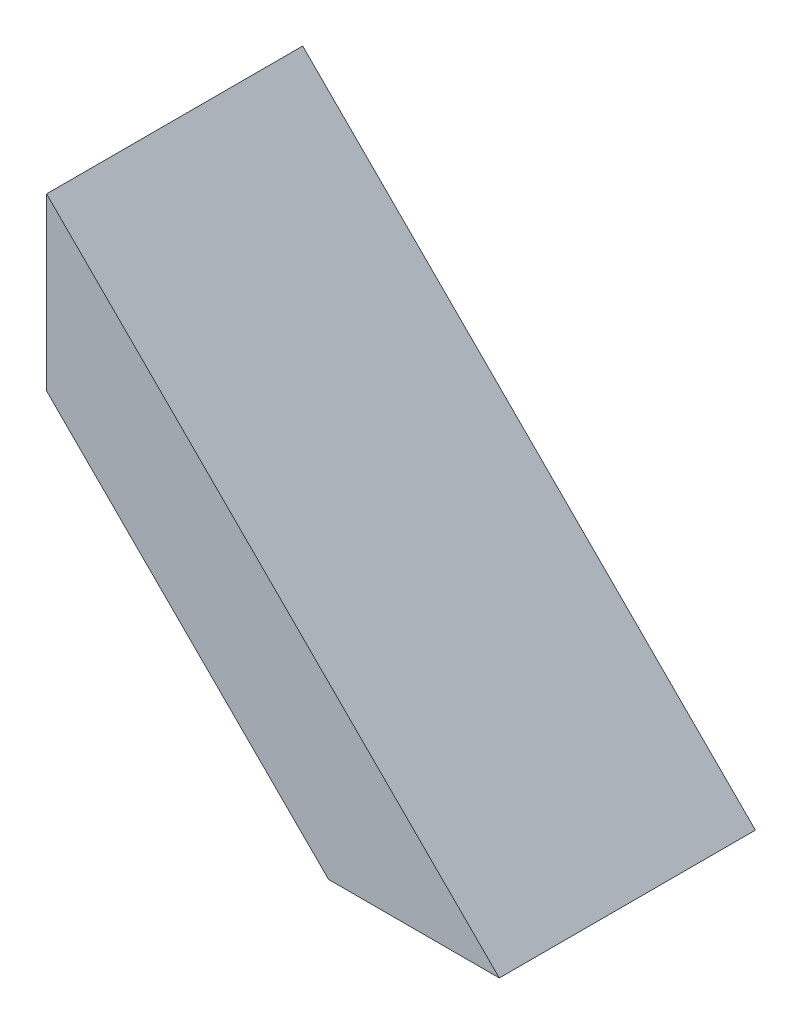
ISO-10303-21;
HEADER;
FILE_DESCRIPTION(('STEP AP214'),'2;1');
FILE_NAME('part.step','',(''),(''),'','','');
FILE_SCHEMA(('AUTOMOTIVE_DESIGN { 1 0 10303 214 1 1 1 1 }'));
ENDSEC;
DATA;
#1=APPLICATION_CONTEXT('core data for automotive mechanical design processes');
#2=APPLICATION_PROTOCOL_DEFINITION('international standard','automotive_design',2000,#1);
#3=PRODUCT_CONTEXT('',#1,'mechanical');
#4=PRODUCT('Part','Part','',(#3));
#5=PRODUCT_RELATED_PRODUCT_CATEGORY('part','',(#4));
#6=PRODUCT_DEFINITION_FORMATION('','',#4);
#7=PRODUCT_DEFINITION_CONTEXT('part definition',#1,'design');
#8=PRODUCT_DEFINITION('design','',#6,#7);
#9=PRODUCT_DEFINITION_SHAPE('','',#8);
#10=(LENGTH_UNIT() NAMED_UNIT(*) SI_UNIT(.MILLI.,.METRE.));
#11=(NAMED_UNIT(*) PLANE_ANGLE_UNIT() SI_UNIT($,.RADIAN.));
#12=(NAMED_UNIT(*) SI_UNIT($,.STERADIAN.) SOLID_ANGLE_UNIT());
#13=UNCERTAINTY_MEASURE_WITH_UNIT(LENGTH_MEASURE(1.E-05),#10,'distance_accuracy_value','');
#14=(GEOMETRIC_REPRESENTATION_CONTEXT(3) GLOBAL_UNCERTAINTY_ASSIGNED_CONTEXT((#13)) GLOBAL_UNIT_ASSIGNED_CONTEXT((#10,
#11,#12)) REPRESENTATION_CONTEXT('',''));
#15=CARTESIAN_POINT('',(0.,0.,0.));
#16=DIRECTION('',(0.,0.,1.));
#17=DIRECTION('',(1.,0.,0.));
#18=AXIS2_PLACEMENT_3D('',#15,#16,#17);
#19=CARTESIAN_POINT('',(3.41548725996691,-10.8841867469879,6.));
#20=DIRECTION('',(-0.707106781186548,-0.707106781186547,0.));
#21=DIRECTION('',(0.707106781186547,-0.707106781186548,0.));
#22=AXIS2_PLACEMENT_3D('',#19,#20,#21);
#23=PLANE('',#22);
#24=DIRECTION('',(-0.707106781186547,0.707106781186548,0.));
#25=VECTOR('',#24,1.);
#26=CARTESIAN_POINT('',(3.41548725996691,-10.8841867469879,0.));
#27=LINE('',#26,#25);
#28=CARTESIAN_POINT('',(3.41548725996691,-10.8841867469879,0.));
#29=VERTEX_POINT('',#28);
#30=CARTESIAN_POINT('',(-7.1911144578313,-0.277585029189721,0.));
#31=VERTEX_POINT('',#30);
#32=EDGE_CURVE('E107',#29,#31,#27,.T.);
#33=ORIENTED_EDGE('',*,*,#32,.T.);
#34=DIRECTION('',(0.,0.,-1.));
#35=VECTOR('',#34,1.);
#36=CARTESIAN_POINT('',(-7.1911144578313,-0.277585029189721,6.));
#37=LINE('',#36,#35);
#38=CARTESIAN_POINT('',(-7.1911144578313,-0.277585029189721,6.));
#39=VERTEX_POINT('',#38);
#40=EDGE_CURVE('E11',#39,#31,#37,.T.);
#41=ORIENTED_EDGE('',*,*,#40,.F.);
#42=DIRECTION('',(-0.707106781186547,0.707106781186548,0.));
#43=VECTOR('',#42,1.);
#44=CARTESIAN_POINT('',(3.41548725996691,-10.8841867469879,6.));
#45=LINE('',#44,#43);
#46=CARTESIAN_POINT('',(3.41548725996691,-10.8841867469879,6.));
#47=VERTEX_POINT('',#46);
#48=EDGE_CURVE('E91',#47,#39,#45,.T.);
#49=ORIENTED_EDGE('',*,*,#48,.F.);
#50=DIRECTION('',(0.,0.,-1.));
#51=VECTOR('',#50,1.);
#52=CARTESIAN_POINT('',(3.41548725996691,-10.8841867469879,6.));
#53=LINE('',#52,#51);
#54=EDGE_CURVE('E103',#47,#29,#53,.T.);
#55=ORIENTED_EDGE('',*,*,#54,.T.);
#56=EDGE_LOOP('',(#33,#41,#49,#55));
#57=FACE_BOUND('',#56,.T.);
#58=ADVANCED_FACE('F39',(#57),#23,.F.);
#59=CARTESIAN_POINT('',(-7.1911144578313,-0.277585029189721,6.));
#60=DIRECTION('',(1.,0.,0.));
#61=DIRECTION('',(0.,1.,0.));
#62=AXIS2_PLACEMENT_3D('',#59,#60,#61);
#63=PLANE('',#62);
#64=DIRECTION('',(0.,-1.,0.));
#65=VECTOR('',#64,1.);
#66=CARTESIAN_POINT('',(-7.1911144578313,-0.277585029189721,0.));
#67=LINE('',#66,#65);
#68=CARTESIAN_POINT('',(-7.19111445783131,-4.27758502918972,0.));
#69=VERTEX_POINT('',#68);
#70=EDGE_CURVE('E96',#31,#69,#67,.T.);
#71=ORIENTED_EDGE('',*,*,#70,.T.);
#72=DIRECTION('',(0.,0.,-1.));
#73=VECTOR('',#72,1.);
#74=CARTESIAN_POINT('',(-7.19111445783131,-4.27758502918972,6.));
#75=LINE('',#74,#73);
#76=CARTESIAN_POINT('',(-7.19111445783131,-4.27758502918972,6.));
#77=VERTEX_POINT('',#76);
#78=EDGE_CURVE('E48',#77,#69,#75,.T.);
#79=ORIENTED_EDGE('',*,*,#78,.F.);
#80=DIRECTION('',(0.,-1.,0.));
#81=VECTOR('',#80,1.);
#82=CARTESIAN_POINT('',(-7.1911144578313,-0.277585029189721,6.));
#83=LINE('',#82,#81);
#84=EDGE_CURVE('E86',#39,#77,#83,.T.);
#85=ORIENTED_EDGE('',*,*,#84,.F.);
#86=ORIENTED_EDGE('',*,*,#40,.T.);
#87=EDGE_LOOP('',(#71,#79,#85,#86));
#88=FACE_BOUND('',#87,.T.);
#89=ADVANCED_FACE('F95',(#88),#63,.F.);
#90=CARTESIAN_POINT('',(-7.19111445783131,-4.27758502918972,6.));
#91=DIRECTION('',(0.707106781186548,0.707106781186547,0.));
#92=DIRECTION('',(-0.707106781186547,0.707106781186548,0.));
#93=AXIS2_PLACEMENT_3D('',#90,#91,#92);
#94=PLANE('',#93);
#95=DIRECTION('',(0.707106781186547,-0.707106781186548,0.));
#96=VECTOR('',#95,1.);
#97=CARTESIAN_POINT('',(-7.19111445783131,-4.27758502918972,0.));
#98=LINE('',#97,#96);
#99=CARTESIAN_POINT('',(-0.584512740033094,-10.8841867469879,0.));
#100=VERTEX_POINT('',#99);
#101=EDGE_CURVE('E73',#69,#100,#98,.T.);
#102=ORIENTED_EDGE('',*,*,#101,.T.);
#103=DIRECTION('',(0.,0.,-1.));
#104=VECTOR('',#103,1.);
#105=CARTESIAN_POINT('',(-0.584512740033094,-10.8841867469879,6.));
#106=LINE('',#105,#104);
#107=CARTESIAN_POINT('',(-0.584512740033094,-10.8841867469879,6.));
#108=VERTEX_POINT('',#107);
#109=EDGE_CURVE('E98',#108,#100,#106,.T.);
#110=ORIENTED_EDGE('',*,*,#109,.F.);
#111=DIRECTION('',(0.707106781186547,-0.707106781186548,0.));
#112=VECTOR('',#111,1.);
#113=CARTESIAN_POINT('',(-7.19111445783131,-4.27758502918972,6.));
#114=LINE('',#113,#112);
#115=EDGE_CURVE('E89',#77,#108,#114,.T.);
#116=ORIENTED_EDGE('',*,*,#115,.F.);
#117=ORIENTED_EDGE('',*,*,#78,.T.);
#118=EDGE_LOOP('',(#102,#110,#116,#117));
#119=FACE_BOUND('',#118,.T.);
#120=ADVANCED_FACE('F99',(#119),#94,.F.);
#121=CARTESIAN_POINT('',(-0.584512740033094,-10.8841867469879,6.));
#122=DIRECTION('',(0.,1.,0.));
#123=DIRECTION('',(-1.,0.,0.));
#124=AXIS2_PLACEMENT_3D('',#121,#122,#123);
#125=PLANE('',#124);
#126=DIRECTION('',(1.,0.,0.));
#127=VECTOR('',#126,1.);
#128=CARTESIAN_POINT('',(-0.584512740033094,-10.8841867469879,0.));
#129=LINE('',#128,#127);
#130=EDGE_CURVE('E79',#100,#29,#129,.T.);
#131=ORIENTED_EDGE('',*,*,#130,.T.);
#132=ORIENTED_EDGE('',*,*,#54,.F.);
#133=DIRECTION('',(1.,0.,0.));
#134=VECTOR('',#133,1.);
#135=CARTESIAN_POINT('',(-0.584512740033094,-10.8841867469879,6.));
#136=LINE('',#135,#134);
#137=EDGE_CURVE('E56',#108,#47,#136,.T.);
#138=ORIENTED_EDGE('',*,*,#137,.F.);
#139=ORIENTED_EDGE('',*,*,#109,.T.);
#140=EDGE_LOOP('',(#131,#132,#138,#139));
#141=FACE_BOUND('',#140,.T.);
#142=ADVANCED_FACE('F120',(#141),#125,.F.);
#143=CARTESIAN_POINT('',(0.,0.,6.));
#144=DIRECTION('',(0.,0.,1.));
#145=DIRECTION('',(1.,0.,0.));
#146=AXIS2_PLACEMENT_3D('',#143,#144,#145);
#147=PLANE('',#146);
#148=ORIENTED_EDGE('',*,*,#48,.T.);
#149=ORIENTED_EDGE('',*,*,#84,.T.);
#150=ORIENTED_EDGE('',*,*,#115,.T.);
#151=ORIENTED_EDGE('',*,*,#137,.T.);
#152=EDGE_LOOP('',(#148,#149,#150,#151));
#153=FACE_BOUND('',#152,.T.);
#154=ADVANCED_FACE('F87',(#153),#147,.T.);
#155=CARTESIAN_POINT('',(0.,0.,0.));
#156=DIRECTION('',(0.,0.,1.));
#157=DIRECTION('',(1.,0.,0.));
#158=AXIS2_PLACEMENT_3D('',#155,#156,#157);
#159=PLANE('',#158);
#160=ORIENTED_EDGE('',*,*,#32,.F.);
#161=ORIENTED_EDGE('',*,*,#130,.F.);
#162=ORIENTED_EDGE('',*,*,#101,.F.);
#163=ORIENTED_EDGE('',*,*,#70,.F.);
#164=EDGE_LOOP('',(#160,#161,#162,#163));
#165=FACE_BOUND('',#164,.T.);
#166=ADVANCED_FACE('F123',(#165),#159,.F.);
#167=CLOSED_SHELL('',(#58,#89,#120,#142,#154,#166));
#168=MANIFOLD_SOLID_BREP('B2',#167);
#169=ADVANCED_BREP_SHAPE_REPRESENTATION('',(#18,#168),#14);
#170=SHAPE_DEFINITION_REPRESENTATION(#9,#169);
ENDSEC;
END-ISO-10303-21;
